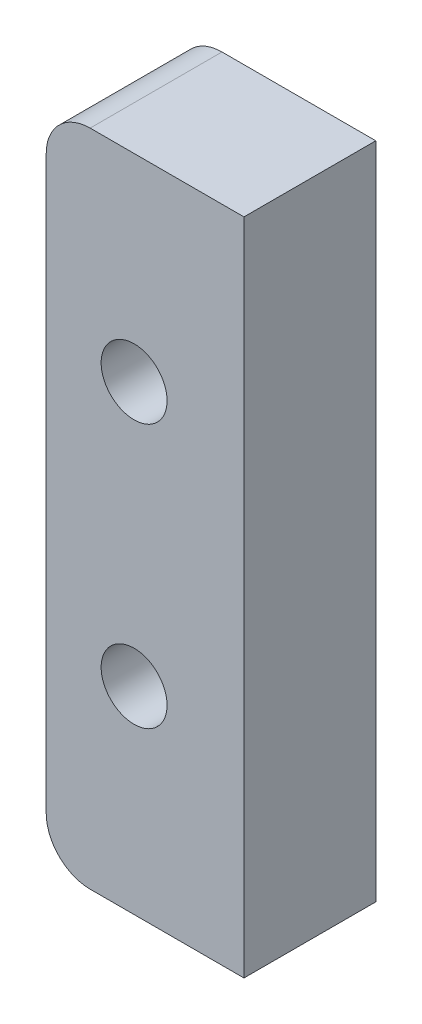
ISO-10303-21;
HEADER;
FILE_DESCRIPTION(('STEP AP214'),'2;1');
FILE_NAME('part.step','',(''),(''),'','','');
FILE_SCHEMA(('AUTOMOTIVE_DESIGN { 1 0 10303 214 1 1 1 1 }'));
ENDSEC;
DATA;
#1=APPLICATION_CONTEXT('core data for automotive mechanical design processes');
#2=APPLICATION_PROTOCOL_DEFINITION('international standard','automotive_design',2000,#1);
#3=PRODUCT_CONTEXT('',#1,'mechanical');
#4=PRODUCT('Part','Part','',(#3));
#5=PRODUCT_RELATED_PRODUCT_CATEGORY('part','',(#4));
#6=PRODUCT_DEFINITION_FORMATION('','',#4);
#7=PRODUCT_DEFINITION_CONTEXT('part definition',#1,'design');
#8=PRODUCT_DEFINITION('design','',#6,#7);
#9=PRODUCT_DEFINITION_SHAPE('','',#8);
#10=(LENGTH_UNIT() NAMED_UNIT(*) SI_UNIT(.MILLI.,.METRE.));
#11=(NAMED_UNIT(*) PLANE_ANGLE_UNIT() SI_UNIT($,.RADIAN.));
#12=(NAMED_UNIT(*) SI_UNIT($,.STERADIAN.) SOLID_ANGLE_UNIT());
#13=UNCERTAINTY_MEASURE_WITH_UNIT(LENGTH_MEASURE(1.E-05),#10,'distance_accuracy_value','');
#14=(GEOMETRIC_REPRESENTATION_CONTEXT(3) GLOBAL_UNCERTAINTY_ASSIGNED_CONTEXT((#13)) GLOBAL_UNIT_ASSIGNED_CONTEXT((#10,
#11,#12)) REPRESENTATION_CONTEXT('',''));
#15=CARTESIAN_POINT('',(0.,0.,0.));
#16=DIRECTION('',(0.,0.,1.));
#17=DIRECTION('',(1.,0.,0.));
#18=AXIS2_PLACEMENT_3D('',#15,#16,#17);
#19=CARTESIAN_POINT('',(0.,0.,3.));
#20=DIRECTION('',(0.,0.,1.));
#21=DIRECTION('',(1.,0.,0.));
#22=AXIS2_PLACEMENT_3D('',#19,#20,#21);
#23=PLANE('',#22);
#24=CARTESIAN_POINT('',(-0.5,-6.,3.));
#25=DIRECTION('',(0.,0.,-1.));
#26=DIRECTION('',(-1.,0.,0.));
#27=AXIS2_PLACEMENT_3D('',#24,#25,#26);
#28=CIRCLE('',#27,1.5);
#29=CARTESIAN_POINT('',(1.,-6.,3.));
#30=VERTEX_POINT('',#29);
#31=EDGE_CURVE('E144',#30,#30,#28,.T.);
#32=ORIENTED_EDGE('',*,*,#31,.T.);
#33=EDGE_LOOP('',(#32));
#34=FACE_BOUND('',#33,.T.);
#35=CARTESIAN_POINT('',(-0.5,6.,3.));
#36=DIRECTION('',(0.,0.,-1.));
#37=DIRECTION('',(-1.,0.,0.));
#38=AXIS2_PLACEMENT_3D('',#35,#36,#37);
#39=CIRCLE('',#38,1.5);
#40=CARTESIAN_POINT('',(1.,6.,3.));
#41=VERTEX_POINT('',#40);
#42=EDGE_CURVE('E174',#41,#41,#39,.T.);
#43=ORIENTED_EDGE('',*,*,#42,.T.);
#44=EDGE_LOOP('',(#43));
#45=FACE_BOUND('',#44,.T.);
#46=CARTESIAN_POINT('',(-2.5,13.,3.));
#47=DIRECTION('',(0.,0.,-1.));
#48=DIRECTION('',(-0.707106781186548,0.707106781186547,0.));
#49=AXIS2_PLACEMENT_3D('',#46,#47,#48);
#50=CIRCLE('',#49,2.);
#51=CARTESIAN_POINT('',(-4.5,13.,3.));
#52=VERTEX_POINT('',#51);
#53=CARTESIAN_POINT('',(-2.5,15.,3.));
#54=VERTEX_POINT('',#53);
#55=EDGE_CURVE('E128',#52,#54,#50,.T.);
#56=ORIENTED_EDGE('',*,*,#55,.F.);
#57=DIRECTION('',(0.,-1.,0.));
#58=VECTOR('',#57,1.);
#59=CARTESIAN_POINT('',(-4.5,15.,3.));
#60=LINE('',#59,#58);
#61=CARTESIAN_POINT('',(-4.5,-13.,3.));
#62=VERTEX_POINT('',#61);
#63=EDGE_CURVE('E102',#52,#62,#60,.T.);
#64=ORIENTED_EDGE('',*,*,#63,.T.);
#65=CARTESIAN_POINT('',(-2.5,-13.,3.));
#66=DIRECTION('',(0.,0.,-1.));
#67=DIRECTION('',(-0.707106781186548,-0.707106781186547,0.));
#68=AXIS2_PLACEMENT_3D('',#65,#66,#67);
#69=CIRCLE('',#68,2.);
#70=CARTESIAN_POINT('',(-2.5,-15.,3.));
#71=VERTEX_POINT('',#70);
#72=EDGE_CURVE('E160',#71,#62,#69,.T.);
#73=ORIENTED_EDGE('',*,*,#72,.F.);
#74=DIRECTION('',(1.,0.,0.));
#75=VECTOR('',#74,1.);
#76=CARTESIAN_POINT('',(-4.5,-15.,3.));
#77=LINE('',#76,#75);
#78=CARTESIAN_POINT('',(4.5,-15.,3.));
#79=VERTEX_POINT('',#78);
#80=EDGE_CURVE('E142',#71,#79,#77,.T.);
#81=ORIENTED_EDGE('',*,*,#80,.T.);
#82=DIRECTION('',(0.,1.,0.));
#83=VECTOR('',#82,1.);
#84=CARTESIAN_POINT('',(4.5,-15.,3.));
#85=LINE('',#84,#83);
#86=CARTESIAN_POINT('',(4.5,15.,3.));
#87=VERTEX_POINT('',#86);
#88=EDGE_CURVE('E11',#79,#87,#85,.T.);
#89=ORIENTED_EDGE('',*,*,#88,.T.);
#90=DIRECTION('',(-1.,0.,0.));
#91=VECTOR('',#90,1.);
#92=CARTESIAN_POINT('',(4.5,15.,3.));
#93=LINE('',#92,#91);
#94=EDGE_CURVE('E173',#87,#54,#93,.T.);
#95=ORIENTED_EDGE('',*,*,#94,.T.);
#96=EDGE_LOOP('',(#56,#64,#73,#81,#89,#95));
#97=FACE_BOUND('',#96,.T.);
#98=ADVANCED_FACE('F16',(#34,#45,#97),#23,.T.);
#99=CARTESIAN_POINT('',(4.5,-15.,0.));
#100=DIRECTION('',(1.,0.,0.));
#101=DIRECTION('',(0.,1.,0.));
#102=AXIS2_PLACEMENT_3D('',#99,#100,#101);
#103=PLANE('',#102);
#104=DIRECTION('',(0.,0.,1.));
#105=VECTOR('',#104,1.);
#106=CARTESIAN_POINT('',(4.5,15.,0.));
#107=LINE('',#106,#105);
#108=CARTESIAN_POINT('',(4.5,15.,-3.));
#109=VERTEX_POINT('',#108);
#110=EDGE_CURVE('E27',#109,#87,#107,.T.);
#111=ORIENTED_EDGE('',*,*,#110,.T.);
#112=ORIENTED_EDGE('',*,*,#88,.F.);
#113=DIRECTION('',(0.,0.,1.));
#114=VECTOR('',#113,1.);
#115=CARTESIAN_POINT('',(4.5,-15.,0.));
#116=LINE('',#115,#114);
#117=CARTESIAN_POINT('',(4.5,-15.,-3.));
#118=VERTEX_POINT('',#117);
#119=EDGE_CURVE('E57',#118,#79,#116,.T.);
#120=ORIENTED_EDGE('',*,*,#119,.F.);
#121=DIRECTION('',(0.,-1.,0.));
#122=VECTOR('',#121,1.);
#123=CARTESIAN_POINT('',(4.5,-15.,-3.));
#124=LINE('',#123,#122);
#125=EDGE_CURVE('E164',#109,#118,#124,.T.);
#126=ORIENTED_EDGE('',*,*,#125,.F.);
#127=EDGE_LOOP('',(#111,#112,#120,#126));
#128=FACE_BOUND('',#127,.T.);
#129=ADVANCED_FACE('F237',(#128),#103,.T.);
#130=CARTESIAN_POINT('',(4.5,15.,0.));
#131=DIRECTION('',(0.,1.,0.));
#132=DIRECTION('',(1.,0.,0.));
#133=AXIS2_PLACEMENT_3D('',#130,#131,#132);
#134=PLANE('',#133);
#135=DIRECTION('',(0.,0.,-1.));
#136=VECTOR('',#135,1.);
#137=CARTESIAN_POINT('',(-2.5,15.,0.));
#138=LINE('',#137,#136);
#139=CARTESIAN_POINT('',(-2.5,15.,-3.));
#140=VERTEX_POINT('',#139);
#141=EDGE_CURVE('E120',#54,#140,#138,.T.);
#142=ORIENTED_EDGE('',*,*,#141,.F.);
#143=ORIENTED_EDGE('',*,*,#94,.F.);
#144=ORIENTED_EDGE('',*,*,#110,.F.);
#145=DIRECTION('',(1.,0.,0.));
#146=VECTOR('',#145,1.);
#147=CARTESIAN_POINT('',(4.5,15.,-3.));
#148=LINE('',#147,#146);
#149=EDGE_CURVE('E169',#140,#109,#148,.T.);
#150=ORIENTED_EDGE('',*,*,#149,.F.);
#151=EDGE_LOOP('',(#142,#143,#144,#150));
#152=FACE_BOUND('',#151,.T.);
#153=ADVANCED_FACE('F18',(#152),#134,.T.);
#154=CARTESIAN_POINT('',(-0.5,6.,0.));
#155=DIRECTION('',(0.,0.,1.));
#156=DIRECTION('',(-1.,0.,0.));
#157=AXIS2_PLACEMENT_3D('',#154,#155,#156);
#158=CYLINDRICAL_SURFACE('',#157,1.5);
#159=ORIENTED_EDGE('',*,*,#42,.F.);
#160=DIRECTION('',(0.,0.,-1.));
#161=VECTOR('',#160,1.);
#162=CARTESIAN_POINT('',(1.,6.,0.));
#163=LINE('',#162,#161);
#164=CARTESIAN_POINT('',(1.,6.,-3.));
#165=VERTEX_POINT('',#164);
#166=EDGE_CURVE('E170',#41,#165,#163,.T.);
#167=ORIENTED_EDGE('',*,*,#166,.T.);
#168=CARTESIAN_POINT('',(-0.5,6.,-3.));
#169=DIRECTION('',(0.,0.,1.));
#170=DIRECTION('',(-1.,0.,0.));
#171=AXIS2_PLACEMENT_3D('',#168,#169,#170);
#172=CIRCLE('',#171,1.5);
#173=EDGE_CURVE('E20',#165,#165,#172,.T.);
#174=ORIENTED_EDGE('',*,*,#173,.F.);
#175=ORIENTED_EDGE('',*,*,#166,.F.);
#176=EDGE_LOOP('',(#159,#167,#174,#175));
#177=FACE_BOUND('',#176,.T.);
#178=ADVANCED_FACE('F233',(#177),#158,.F.);
#179=CARTESIAN_POINT('',(-0.5,-6.,0.));
#180=DIRECTION('',(0.,0.,1.));
#181=DIRECTION('',(-1.,0.,0.));
#182=AXIS2_PLACEMENT_3D('',#179,#180,#181);
#183=CYLINDRICAL_SURFACE('',#182,1.5);
#184=ORIENTED_EDGE('',*,*,#31,.F.);
#185=DIRECTION('',(0.,0.,-1.));
#186=VECTOR('',#185,1.);
#187=CARTESIAN_POINT('',(1.,-6.,0.));
#188=LINE('',#187,#186);
#189=CARTESIAN_POINT('',(1.,-6.,-3.));
#190=VERTEX_POINT('',#189);
#191=EDGE_CURVE('E151',#30,#190,#188,.T.);
#192=ORIENTED_EDGE('',*,*,#191,.T.);
#193=CARTESIAN_POINT('',(-0.5,-6.,-3.));
#194=DIRECTION('',(0.,0.,1.));
#195=DIRECTION('',(-1.,0.,0.));
#196=AXIS2_PLACEMENT_3D('',#193,#194,#195);
#197=CIRCLE('',#196,1.5);
#198=EDGE_CURVE('E198',#190,#190,#197,.T.);
#199=ORIENTED_EDGE('',*,*,#198,.F.);
#200=ORIENTED_EDGE('',*,*,#191,.F.);
#201=EDGE_LOOP('',(#184,#192,#199,#200));
#202=FACE_BOUND('',#201,.T.);
#203=ADVANCED_FACE('F225',(#202),#183,.F.);
#204=CARTESIAN_POINT('',(-4.5,-15.,0.));
#205=DIRECTION('',(0.,-1.,0.));
#206=DIRECTION('',(0.,0.,-1.));
#207=AXIS2_PLACEMENT_3D('',#204,#205,#206);
#208=PLANE('',#207);
#209=DIRECTION('',(0.,0.,1.));
#210=VECTOR('',#209,1.);
#211=CARTESIAN_POINT('',(-2.5,-15.,0.));
#212=LINE('',#211,#210);
#213=CARTESIAN_POINT('',(-2.5,-15.,-3.));
#214=VERTEX_POINT('',#213);
#215=EDGE_CURVE('E153',#214,#71,#212,.T.);
#216=ORIENTED_EDGE('',*,*,#215,.F.);
#217=DIRECTION('',(-1.,0.,0.));
#218=VECTOR('',#217,1.);
#219=CARTESIAN_POINT('',(-4.5,-15.,-3.));
#220=LINE('',#219,#218);
#221=EDGE_CURVE('E168',#118,#214,#220,.T.);
#222=ORIENTED_EDGE('',*,*,#221,.F.);
#223=ORIENTED_EDGE('',*,*,#119,.T.);
#224=ORIENTED_EDGE('',*,*,#80,.F.);
#225=EDGE_LOOP('',(#216,#222,#223,#224));
#226=FACE_BOUND('',#225,.T.);
#227=ADVANCED_FACE('F223',(#226),#208,.T.);
#228=CARTESIAN_POINT('',(-2.5,-13.,0.));
#229=DIRECTION('',(0.,0.,1.));
#230=DIRECTION('',(-0.707106781186548,-0.707106781186547,0.));
#231=AXIS2_PLACEMENT_3D('',#228,#229,#230);
#232=CYLINDRICAL_SURFACE('',#231,2.);
#233=ORIENTED_EDGE('',*,*,#72,.T.);
#234=DIRECTION('',(0.,0.,-1.));
#235=VECTOR('',#234,1.);
#236=CARTESIAN_POINT('',(-4.5,-13.,0.));
#237=LINE('',#236,#235);
#238=CARTESIAN_POINT('',(-4.5,-13.,-3.));
#239=VERTEX_POINT('',#238);
#240=EDGE_CURVE('E119',#62,#239,#237,.T.);
#241=ORIENTED_EDGE('',*,*,#240,.T.);
#242=CARTESIAN_POINT('',(-2.5,-13.,-3.));
#243=DIRECTION('',(0.,0.,1.));
#244=DIRECTION('',(-0.707106781186548,-0.707106781186547,0.));
#245=AXIS2_PLACEMENT_3D('',#242,#243,#244);
#246=CIRCLE('',#245,2.);
#247=EDGE_CURVE('E116',#239,#214,#246,.T.);
#248=ORIENTED_EDGE('',*,*,#247,.T.);
#249=ORIENTED_EDGE('',*,*,#215,.T.);
#250=EDGE_LOOP('',(#233,#241,#248,#249));
#251=FACE_BOUND('',#250,.T.);
#252=ADVANCED_FACE('F222',(#251),#232,.T.);
#253=CARTESIAN_POINT('',(0.,0.,-3.));
#254=DIRECTION('',(0.,0.,1.));
#255=DIRECTION('',(1.,0.,0.));
#256=AXIS2_PLACEMENT_3D('',#253,#254,#255);
#257=PLANE('',#256);
#258=ORIENTED_EDGE('',*,*,#198,.T.);
#259=EDGE_LOOP('',(#258));
#260=FACE_BOUND('',#259,.T.);
#261=ORIENTED_EDGE('',*,*,#173,.T.);
#262=EDGE_LOOP('',(#261));
#263=FACE_BOUND('',#262,.T.);
#264=CARTESIAN_POINT('',(-2.5,13.,-3.));
#265=DIRECTION('',(0.,0.,1.));
#266=DIRECTION('',(-0.707106781186548,0.707106781186547,0.));
#267=AXIS2_PLACEMENT_3D('',#264,#265,#266);
#268=CIRCLE('',#267,2.);
#269=CARTESIAN_POINT('',(-4.5,13.,-3.));
#270=VERTEX_POINT('',#269);
#271=EDGE_CURVE('E113',#140,#270,#268,.T.);
#272=ORIENTED_EDGE('',*,*,#271,.F.);
#273=ORIENTED_EDGE('',*,*,#149,.T.);
#274=ORIENTED_EDGE('',*,*,#125,.T.);
#275=ORIENTED_EDGE('',*,*,#221,.T.);
#276=ORIENTED_EDGE('',*,*,#247,.F.);
#277=DIRECTION('',(0.,1.,0.));
#278=VECTOR('',#277,1.);
#279=CARTESIAN_POINT('',(-4.5,15.,-3.));
#280=LINE('',#279,#278);
#281=EDGE_CURVE('E109',#239,#270,#280,.T.);
#282=ORIENTED_EDGE('',*,*,#281,.T.);
#283=EDGE_LOOP('',(#272,#273,#274,#275,#276,#282));
#284=FACE_BOUND('',#283,.T.);
#285=ADVANCED_FACE('F110',(#260,#263,#284),#257,.F.);
#286=CARTESIAN_POINT('',(-4.5,15.,0.));
#287=DIRECTION('',(-1.,0.,0.));
#288=DIRECTION('',(0.,1.,0.));
#289=AXIS2_PLACEMENT_3D('',#286,#287,#288);
#290=PLANE('',#289);
#291=DIRECTION('',(0.,0.,1.));
#292=VECTOR('',#291,1.);
#293=CARTESIAN_POINT('',(-4.5,13.,0.));
#294=LINE('',#293,#292);
#295=EDGE_CURVE('E123',#270,#52,#294,.T.);
#296=ORIENTED_EDGE('',*,*,#295,.F.);
#297=ORIENTED_EDGE('',*,*,#281,.F.);
#298=ORIENTED_EDGE('',*,*,#240,.F.);
#299=ORIENTED_EDGE('',*,*,#63,.F.);
#300=EDGE_LOOP('',(#296,#297,#298,#299));
#301=FACE_BOUND('',#300,.T.);
#302=ADVANCED_FACE('F124',(#301),#290,.T.);
#303=CARTESIAN_POINT('',(-2.5,13.,0.));
#304=DIRECTION('',(0.,0.,-1.));
#305=DIRECTION('',(-0.707106781186548,0.707106781186547,0.));
#306=AXIS2_PLACEMENT_3D('',#303,#304,#305);
#307=CYLINDRICAL_SURFACE('',#306,2.);
#308=ORIENTED_EDGE('',*,*,#271,.T.);
#309=ORIENTED_EDGE('',*,*,#295,.T.);
#310=ORIENTED_EDGE('',*,*,#55,.T.);
#311=ORIENTED_EDGE('',*,*,#141,.T.);
#312=EDGE_LOOP('',(#308,#309,#310,#311));
#313=FACE_BOUND('',#312,.T.);
#314=ADVANCED_FACE('F131',(#313),#307,.T.);
#315=CLOSED_SHELL('',(#98,#129,#153,#178,#203,#227,#252,#285,#302,#314));
#316=MANIFOLD_SOLID_BREP('B1',#315);
#317=ADVANCED_BREP_SHAPE_REPRESENTATION('',(#18,#316),#14);
#318=SHAPE_DEFINITION_REPRESENTATION(#9,#317);
ENDSEC;
END-ISO-10303-21;
